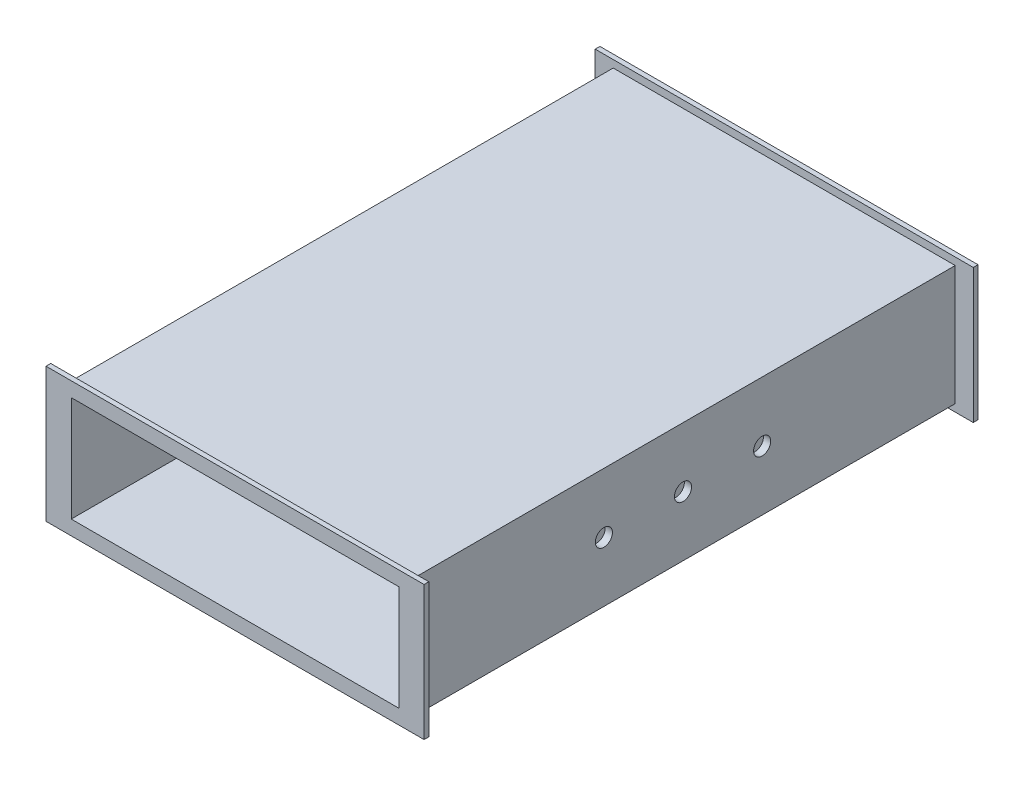
ISO-10303-21;
HEADER;
FILE_DESCRIPTION(('STEP AP214'),'2;1');
FILE_NAME('part.step','',(''),(''),'','','');
FILE_SCHEMA(('AUTOMOTIVE_DESIGN { 1 0 10303 214 1 1 1 1 }'));
ENDSEC;
DATA;
#1=APPLICATION_CONTEXT('core data for automotive mechanical design processes');
#2=APPLICATION_PROTOCOL_DEFINITION('international standard','automotive_design',2000,#1);
#3=PRODUCT_CONTEXT('',#1,'mechanical');
#4=PRODUCT('Part','Part','',(#3));
#5=PRODUCT_RELATED_PRODUCT_CATEGORY('part','',(#4));
#6=PRODUCT_DEFINITION_FORMATION('','',#4);
#7=PRODUCT_DEFINITION_CONTEXT('part definition',#1,'design');
#8=PRODUCT_DEFINITION('design','',#6,#7);
#9=PRODUCT_DEFINITION_SHAPE('','',#8);
#10=(LENGTH_UNIT() NAMED_UNIT(*) SI_UNIT(.MILLI.,.METRE.));
#11=(NAMED_UNIT(*) PLANE_ANGLE_UNIT() SI_UNIT($,.RADIAN.));
#12=(NAMED_UNIT(*) SI_UNIT($,.STERADIAN.) SOLID_ANGLE_UNIT());
#13=UNCERTAINTY_MEASURE_WITH_UNIT(LENGTH_MEASURE(1.E-05),#10,'distance_accuracy_value','');
#14=(GEOMETRIC_REPRESENTATION_CONTEXT(3) GLOBAL_UNCERTAINTY_ASSIGNED_CONTEXT((#13)) GLOBAL_UNIT_ASSIGNED_CONTEXT((#10,
#11,#12)) REPRESENTATION_CONTEXT('',''));
#15=CARTESIAN_POINT('',(0.,0.,0.));
#16=DIRECTION('',(0.,0.,1.));
#17=DIRECTION('',(1.,0.,0.));
#18=AXIS2_PLACEMENT_3D('',#15,#16,#17);
#19=CARTESIAN_POINT('',(0.,0.,247.));
#20=DIRECTION('',(0.,0.,1.));
#21=DIRECTION('',(1.,0.,0.));
#22=AXIS2_PLACEMENT_3D('',#19,#20,#21);
#23=PLANE('',#22);
#24=DIRECTION('',(-1.,0.,0.));
#25=VECTOR('',#24,1.);
#26=CARTESIAN_POINT('',(-19.4454364826301,65.4454364826301,247.));
#27=LINE('',#26,#25);
#28=CARTESIAN_POINT('',(219.44543648263,65.44543648263,247.));
#29=VERTEX_POINT('',#28);
#30=CARTESIAN_POINT('',(-19.4454364826301,65.4454364826301,247.));
#31=VERTEX_POINT('',#30);
#32=EDGE_CURVE('E266',#29,#31,#27,.T.);
#33=ORIENTED_EDGE('',*,*,#32,.F.);
#34=DIRECTION('',(0.,1.,0.));
#35=VECTOR('',#34,1.);
#36=CARTESIAN_POINT('',(219.44543648263,-19.44543648263,247.));
#37=LINE('',#36,#35);
#38=CARTESIAN_POINT('',(219.44543648263,-19.44543648263,247.));
#39=VERTEX_POINT('',#38);
#40=EDGE_CURVE('E276',#39,#29,#37,.T.);
#41=ORIENTED_EDGE('',*,*,#40,.F.);
#42=DIRECTION('',(1.,0.,0.));
#43=VECTOR('',#42,1.);
#44=CARTESIAN_POINT('',(-19.4454364826301,-19.4454364826301,247.));
#45=LINE('',#44,#43);
#46=CARTESIAN_POINT('',(-19.4454364826301,-19.4454364826301,247.));
#47=VERTEX_POINT('',#46);
#48=EDGE_CURVE('E273',#47,#39,#45,.T.);
#49=ORIENTED_EDGE('',*,*,#48,.F.);
#50=DIRECTION('',(0.,-1.,0.));
#51=VECTOR('',#50,1.);
#52=CARTESIAN_POINT('',(-19.4454364826301,65.4454364826301,247.));
#53=LINE('',#52,#51);
#54=EDGE_CURVE('E269',#31,#47,#53,.T.);
#55=ORIENTED_EDGE('',*,*,#54,.F.);
#56=EDGE_LOOP('',(#33,#41,#49,#55));
#57=FACE_BOUND('',#56,.T.);
#58=DIRECTION('',(-1.,0.,0.));
#59=VECTOR('',#58,1.);
#60=CARTESIAN_POINT('',(208.051208249702,60.794841987756,247.));
#61=LINE('',#60,#59);
#62=CARTESIAN_POINT('',(208.051208249702,60.794841987756,247.));
#63=VERTEX_POINT('',#62);
#64=CARTESIAN_POINT('',(-8.05120824970154,60.794841987756,247.));
#65=VERTEX_POINT('',#64);
#66=EDGE_CURVE('E218',#63,#65,#61,.T.);
#67=ORIENTED_EDGE('',*,*,#66,.T.);
#68=DIRECTION('',(0.,-1.,0.));
#69=VECTOR('',#68,1.);
#70=CARTESIAN_POINT('',(-8.05120824970155,60.794841987756,247.));
#71=LINE('',#70,#69);
#72=CARTESIAN_POINT('',(-8.05120824970155,-14.7948419877559,247.));
#73=VERTEX_POINT('',#72);
#74=EDGE_CURVE('E227',#65,#73,#71,.T.);
#75=ORIENTED_EDGE('',*,*,#74,.T.);
#76=DIRECTION('',(1.,0.,0.));
#77=VECTOR('',#76,1.);
#78=CARTESIAN_POINT('',(-8.05120824970155,-14.7948419877559,247.));
#79=LINE('',#78,#77);
#80=CARTESIAN_POINT('',(208.051208249702,-14.7948419877558,247.));
#81=VERTEX_POINT('',#80);
#82=EDGE_CURVE('E70',#73,#81,#79,.T.);
#83=ORIENTED_EDGE('',*,*,#82,.T.);
#84=DIRECTION('',(0.,1.,0.));
#85=VECTOR('',#84,1.);
#86=CARTESIAN_POINT('',(208.051208249702,-14.7948419877558,247.));
#87=LINE('',#86,#85);
#88=EDGE_CURVE('E65',#81,#63,#87,.T.);
#89=ORIENTED_EDGE('',*,*,#88,.T.);
#90=EDGE_LOOP('',(#67,#75,#83,#89));
#91=FACE_BOUND('',#90,.T.);
#92=ADVANCED_FACE('F48',(#57,#91),#23,.F.);
#93=CARTESIAN_POINT('',(-19.4454364826301,65.4454364826301,247.));
#94=DIRECTION('',(0.,1.,0.));
#95=DIRECTION('',(-1.,0.,0.));
#96=AXIS2_PLACEMENT_3D('',#93,#94,#95);
#97=PLANE('',#96);
#98=DIRECTION('',(-1.,0.,0.));
#99=VECTOR('',#98,1.);
#100=CARTESIAN_POINT('',(-19.4454364826301,65.4454364826301,250.));
#101=LINE('',#100,#99);
#102=CARTESIAN_POINT('',(219.44543648263,65.44543648263,250.));
#103=VERTEX_POINT('',#102);
#104=CARTESIAN_POINT('',(-19.4454364826301,65.4454364826301,250.));
#105=VERTEX_POINT('',#104);
#106=EDGE_CURVE('E170',#103,#105,#101,.T.);
#107=ORIENTED_EDGE('',*,*,#106,.F.);
#108=DIRECTION('',(0.,0.,1.));
#109=VECTOR('',#108,1.);
#110=CARTESIAN_POINT('',(219.44543648263,65.44543648263,247.));
#111=LINE('',#110,#109);
#112=EDGE_CURVE('E12',#29,#103,#111,.T.);
#113=ORIENTED_EDGE('',*,*,#112,.F.);
#114=ORIENTED_EDGE('',*,*,#32,.T.);
#115=DIRECTION('',(0.,0.,1.));
#116=VECTOR('',#115,1.);
#117=CARTESIAN_POINT('',(-19.4454364826301,65.4454364826301,247.));
#118=LINE('',#117,#116);
#119=EDGE_CURVE('E279',#31,#105,#118,.T.);
#120=ORIENTED_EDGE('',*,*,#119,.T.);
#121=EDGE_LOOP('',(#107,#113,#114,#120));
#122=FACE_BOUND('',#121,.T.);
#123=ADVANCED_FACE('F50',(#122),#97,.T.);
#124=CARTESIAN_POINT('',(219.44543648263,-19.44543648263,247.));
#125=DIRECTION('',(1.,0.,0.));
#126=DIRECTION('',(0.,1.,0.));
#127=AXIS2_PLACEMENT_3D('',#124,#125,#126);
#128=PLANE('',#127);
#129=DIRECTION('',(0.,1.,0.));
#130=VECTOR('',#129,1.);
#131=CARTESIAN_POINT('',(219.44543648263,-19.44543648263,250.));
#132=LINE('',#131,#130);
#133=CARTESIAN_POINT('',(219.44543648263,-19.44543648263,250.));
#134=VERTEX_POINT('',#133);
#135=EDGE_CURVE('E270',#134,#103,#132,.T.);
#136=ORIENTED_EDGE('',*,*,#135,.F.);
#137=DIRECTION('',(0.,0.,1.));
#138=VECTOR('',#137,1.);
#139=CARTESIAN_POINT('',(219.44543648263,-19.44543648263,247.));
#140=LINE('',#139,#138);
#141=EDGE_CURVE('E57',#39,#134,#140,.T.);
#142=ORIENTED_EDGE('',*,*,#141,.F.);
#143=ORIENTED_EDGE('',*,*,#40,.T.);
#144=ORIENTED_EDGE('',*,*,#112,.T.);
#145=EDGE_LOOP('',(#136,#142,#143,#144));
#146=FACE_BOUND('',#145,.T.);
#147=ADVANCED_FACE('F352',(#146),#128,.T.);
#148=CARTESIAN_POINT('',(-19.4454364826301,-19.4454364826301,247.));
#149=DIRECTION('',(0.,-1.,0.));
#150=DIRECTION('',(1.,0.,0.));
#151=AXIS2_PLACEMENT_3D('',#148,#149,#150);
#152=PLANE('',#151);
#153=DIRECTION('',(1.,0.,0.));
#154=VECTOR('',#153,1.);
#155=CARTESIAN_POINT('',(-19.4454364826301,-19.4454364826301,250.));
#156=LINE('',#155,#154);
#157=CARTESIAN_POINT('',(-19.4454364826301,-19.4454364826301,250.));
#158=VERTEX_POINT('',#157);
#159=EDGE_CURVE('E285',#158,#134,#156,.T.);
#160=ORIENTED_EDGE('',*,*,#159,.F.);
#161=DIRECTION('',(0.,0.,1.));
#162=VECTOR('',#161,1.);
#163=CARTESIAN_POINT('',(-19.4454364826301,-19.4454364826301,247.));
#164=LINE('',#163,#162);
#165=EDGE_CURVE('E291',#47,#158,#164,.T.);
#166=ORIENTED_EDGE('',*,*,#165,.F.);
#167=ORIENTED_EDGE('',*,*,#48,.T.);
#168=ORIENTED_EDGE('',*,*,#141,.T.);
#169=EDGE_LOOP('',(#160,#166,#167,#168));
#170=FACE_BOUND('',#169,.T.);
#171=ADVANCED_FACE('F350',(#170),#152,.T.);
#172=CARTESIAN_POINT('',(-19.4454364826301,65.4454364826301,247.));
#173=DIRECTION('',(-1.,0.,0.));
#174=DIRECTION('',(0.,0.,1.));
#175=AXIS2_PLACEMENT_3D('',#172,#173,#174);
#176=PLANE('',#175);
#177=DIRECTION('',(0.,-1.,0.));
#178=VECTOR('',#177,1.);
#179=CARTESIAN_POINT('',(-19.4454364826301,65.4454364826301,250.));
#180=LINE('',#179,#178);
#181=EDGE_CURVE('E282',#105,#158,#180,.T.);
#182=ORIENTED_EDGE('',*,*,#181,.F.);
#183=ORIENTED_EDGE('',*,*,#119,.F.);
#184=ORIENTED_EDGE('',*,*,#54,.T.);
#185=ORIENTED_EDGE('',*,*,#165,.T.);
#186=EDGE_LOOP('',(#182,#183,#184,#185));
#187=FACE_BOUND('',#186,.T.);
#188=ADVANCED_FACE('F338',(#187),#176,.T.);
#189=CARTESIAN_POINT('',(0.,0.,250.));
#190=DIRECTION('',(0.,0.,1.));
#191=DIRECTION('',(1.,0.,0.));
#192=AXIS2_PLACEMENT_3D('',#189,#190,#191);
#193=PLANE('',#192);
#194=DIRECTION('',(0.,-1.,0.));
#195=VECTOR('',#194,1.);
#196=CARTESIAN_POINT('',(-3.48982774457575,56.233463869769,250.));
#197=LINE('',#196,#195);
#198=CARTESIAN_POINT('',(-3.48982774457575,56.233463869769,250.));
#199=VERTEX_POINT('',#198);
#200=CARTESIAN_POINT('',(-3.48982774457575,-10.23346148263,250.));
#201=VERTEX_POINT('',#200);
#202=EDGE_CURVE('E253',#199,#201,#197,.T.);
#203=ORIENTED_EDGE('',*,*,#202,.F.);
#204=DIRECTION('',(-1.,0.,0.));
#205=VECTOR('',#204,1.);
#206=CARTESIAN_POINT('',(-3.48982774457575,56.233463869769,250.));
#207=LINE('',#206,#205);
#208=CARTESIAN_POINT('',(203.48983084556,56.2334638697689,250.));
#209=VERTEX_POINT('',#208);
#210=EDGE_CURVE('E167',#209,#199,#207,.T.);
#211=ORIENTED_EDGE('',*,*,#210,.F.);
#212=DIRECTION('',(0.,1.,0.));
#213=VECTOR('',#212,1.);
#214=CARTESIAN_POINT('',(203.48983084556,56.2334638697689,250.));
#215=LINE('',#214,#213);
#216=CARTESIAN_POINT('',(203.48983084556,-10.23346148263,250.));
#217=VERTEX_POINT('',#216);
#218=EDGE_CURVE('E258',#217,#209,#215,.T.);
#219=ORIENTED_EDGE('',*,*,#218,.F.);
#220=DIRECTION('',(1.,0.,0.));
#221=VECTOR('',#220,1.);
#222=CARTESIAN_POINT('',(203.48983084556,-10.23346148263,250.));
#223=LINE('',#222,#221);
#224=EDGE_CURVE('E255',#201,#217,#223,.T.);
#225=ORIENTED_EDGE('',*,*,#224,.F.);
#226=EDGE_LOOP('',(#203,#211,#219,#225));
#227=FACE_BOUND('',#226,.T.);
#228=ORIENTED_EDGE('',*,*,#106,.T.);
#229=ORIENTED_EDGE('',*,*,#181,.T.);
#230=ORIENTED_EDGE('',*,*,#159,.T.);
#231=ORIENTED_EDGE('',*,*,#135,.T.);
#232=EDGE_LOOP('',(#228,#229,#230,#231));
#233=FACE_BOUND('',#232,.T.);
#234=ADVANCED_FACE('F335',(#227,#233),#193,.T.);
#235=CARTESIAN_POINT('',(-3.48982774457575,56.233463869769,247.));
#236=DIRECTION('',(-1.,0.,0.));
#237=DIRECTION('',(0.,-1.,0.));
#238=AXIS2_PLACEMENT_3D('',#235,#236,#237);
#239=PLANE('',#238);
#240=CARTESIAN_POINT('',(-3.48982774457576,23.,75.));
#241=DIRECTION('',(-1.,0.,0.));
#242=DIRECTION('',(0.,-1.,0.));
#243=AXIS2_PLACEMENT_3D('',#240,#241,#242);
#244=CIRCLE('',#243,5.4);
#245=CARTESIAN_POINT('',(-3.48982774457576,17.6,75.));
#246=VERTEX_POINT('',#245);
#247=EDGE_CURVE('E326',#246,#246,#244,.T.);
#248=ORIENTED_EDGE('',*,*,#247,.T.);
#249=EDGE_LOOP('',(#248));
#250=FACE_BOUND('',#249,.T.);
#251=CARTESIAN_POINT('',(-3.48982774457576,23.,125.));
#252=DIRECTION('',(-1.,0.,0.));
#253=DIRECTION('',(0.,-1.,0.));
#254=AXIS2_PLACEMENT_3D('',#251,#252,#253);
#255=CIRCLE('',#254,5.40000000000002);
#256=CARTESIAN_POINT('',(-3.48982774457576,17.6,125.));
#257=VERTEX_POINT('',#256);
#258=EDGE_CURVE('E317',#257,#257,#255,.T.);
#259=ORIENTED_EDGE('',*,*,#258,.T.);
#260=EDGE_LOOP('',(#259));
#261=FACE_BOUND('',#260,.T.);
#262=CARTESIAN_POINT('',(-3.48982774457576,22.9999999999997,25.));
#263=DIRECTION('',(-1.,0.,0.));
#264=DIRECTION('',(0.,-1.,0.));
#265=AXIS2_PLACEMENT_3D('',#262,#263,#264);
#266=CIRCLE('',#265,5.4);
#267=CARTESIAN_POINT('',(-3.48982774457576,17.5999999999997,25.));
#268=VERTEX_POINT('',#267);
#269=EDGE_CURVE('E300',#268,#268,#266,.T.);
#270=ORIENTED_EDGE('',*,*,#269,.T.);
#271=EDGE_LOOP('',(#270));
#272=FACE_BOUND('',#271,.T.);
#273=ORIENTED_EDGE('',*,*,#202,.T.);
#274=DIRECTION('',(0.,0.,1.));
#275=VECTOR('',#274,1.);
#276=CARTESIAN_POINT('',(-3.48982774457575,-10.23346148263,247.));
#277=LINE('',#276,#275);
#278=CARTESIAN_POINT('',(-3.48982774457569,-10.23346148263,-100.));
#279=VERTEX_POINT('',#278);
#280=EDGE_CURVE('E177',#279,#201,#277,.T.);
#281=ORIENTED_EDGE('',*,*,#280,.F.);
#282=DIRECTION('',(0.,1.,0.));
#283=VECTOR('',#282,1.);
#284=CARTESIAN_POINT('',(-3.48982774457569,56.2334614826301,-100.));
#285=LINE('',#284,#283);
#286=CARTESIAN_POINT('',(-3.48982774457569,56.2334614826301,-100.));
#287=VERTEX_POINT('',#286);
#288=EDGE_CURVE('E174',#279,#287,#285,.T.);
#289=ORIENTED_EDGE('',*,*,#288,.T.);
#290=DIRECTION('',(0.,0.,1.));
#291=VECTOR('',#290,1.);
#292=CARTESIAN_POINT('',(-3.48982774457575,56.233463869769,247.));
#293=LINE('',#292,#291);
#294=EDGE_CURVE('E160',#287,#199,#293,.T.);
#295=ORIENTED_EDGE('',*,*,#294,.T.);
#296=EDGE_LOOP('',(#273,#281,#289,#295));
#297=FACE_BOUND('',#296,.T.);
#298=ADVANCED_FACE('F175',(#250,#261,#272,#297),#239,.F.);
#299=CARTESIAN_POINT('',(-3.48982774457575,56.233463869769,247.));
#300=DIRECTION('',(0.,1.,0.));
#301=DIRECTION('',(-1.,0.,0.));
#302=AXIS2_PLACEMENT_3D('',#299,#300,#301);
#303=PLANE('',#302);
#304=ORIENTED_EDGE('',*,*,#210,.T.);
#305=ORIENTED_EDGE('',*,*,#294,.F.);
#306=DIRECTION('',(1.,0.,0.));
#307=VECTOR('',#306,1.);
#308=CARTESIAN_POINT('',(203.489827744576,56.23346148263,-100.));
#309=LINE('',#308,#307);
#310=CARTESIAN_POINT('',(203.489827744576,56.23346148263,-100.));
#311=VERTEX_POINT('',#310);
#312=EDGE_CURVE('E164',#287,#311,#309,.T.);
#313=ORIENTED_EDGE('',*,*,#312,.T.);
#314=DIRECTION('',(0.,0.,1.));
#315=VECTOR('',#314,1.);
#316=CARTESIAN_POINT('',(203.48983084556,56.2334638697689,247.));
#317=LINE('',#316,#315);
#318=EDGE_CURVE('E171',#311,#209,#317,.T.);
#319=ORIENTED_EDGE('',*,*,#318,.T.);
#320=EDGE_LOOP('',(#304,#305,#313,#319));
#321=FACE_BOUND('',#320,.T.);
#322=ADVANCED_FACE('F162',(#321),#303,.F.);
#323=CARTESIAN_POINT('',(203.48983084556,56.2334638697689,247.));
#324=DIRECTION('',(1.,0.,0.));
#325=DIRECTION('',(0.,1.,0.));
#326=AXIS2_PLACEMENT_3D('',#323,#324,#325);
#327=PLANE('',#326);
#328=CARTESIAN_POINT('',(203.48983084556,23.,75.));
#329=DIRECTION('',(1.,0.,0.));
#330=DIRECTION('',(0.,1.,0.));
#331=AXIS2_PLACEMENT_3D('',#328,#329,#330);
#332=CIRCLE('',#331,5.4);
#333=CARTESIAN_POINT('',(203.48983084556,28.4,75.));
#334=VERTEX_POINT('',#333);
#335=EDGE_CURVE('E323',#334,#334,#332,.T.);
#336=ORIENTED_EDGE('',*,*,#335,.T.);
#337=EDGE_LOOP('',(#336));
#338=FACE_BOUND('',#337,.T.);
#339=CARTESIAN_POINT('',(203.48983084556,23.,125.));
#340=DIRECTION('',(1.,0.,0.));
#341=DIRECTION('',(0.,1.,0.));
#342=AXIS2_PLACEMENT_3D('',#339,#340,#341);
#343=CIRCLE('',#342,5.40000000000002);
#344=CARTESIAN_POINT('',(203.48983084556,28.4,125.));
#345=VERTEX_POINT('',#344);
#346=EDGE_CURVE('E304',#345,#345,#343,.T.);
#347=ORIENTED_EDGE('',*,*,#346,.T.);
#348=EDGE_LOOP('',(#347));
#349=FACE_BOUND('',#348,.T.);
#350=CARTESIAN_POINT('',(203.48983084556,22.9999999999997,25.));
#351=DIRECTION('',(1.,0.,0.));
#352=DIRECTION('',(0.,1.,0.));
#353=AXIS2_PLACEMENT_3D('',#350,#351,#352);
#354=CIRCLE('',#353,5.4);
#355=CARTESIAN_POINT('',(203.48983084556,28.3999999999997,25.));
#356=VERTEX_POINT('',#355);
#357=EDGE_CURVE('E307',#356,#356,#354,.T.);
#358=ORIENTED_EDGE('',*,*,#357,.T.);
#359=EDGE_LOOP('',(#358));
#360=FACE_BOUND('',#359,.T.);
#361=ORIENTED_EDGE('',*,*,#218,.T.);
#362=ORIENTED_EDGE('',*,*,#318,.F.);
#363=DIRECTION('',(0.,-1.,0.));
#364=VECTOR('',#363,1.);
#365=CARTESIAN_POINT('',(203.489827744576,-10.23346148263,-100.));
#366=LINE('',#365,#364);
#367=CARTESIAN_POINT('',(203.489827744576,-10.23346148263,-100.));
#368=VERTEX_POINT('',#367);
#369=EDGE_CURVE('E186',#311,#368,#366,.T.);
#370=ORIENTED_EDGE('',*,*,#369,.T.);
#371=DIRECTION('',(0.,0.,1.));
#372=VECTOR('',#371,1.);
#373=CARTESIAN_POINT('',(203.48983084556,-10.23346148263,247.));
#374=LINE('',#373,#372);
#375=EDGE_CURVE('E263',#368,#217,#374,.T.);
#376=ORIENTED_EDGE('',*,*,#375,.T.);
#377=EDGE_LOOP('',(#361,#362,#370,#376));
#378=FACE_BOUND('',#377,.T.);
#379=ADVANCED_FACE('F333',(#338,#349,#360,#378),#327,.F.);
#380=CARTESIAN_POINT('',(203.48983084556,-10.23346148263,247.));
#381=DIRECTION('',(0.,-1.,0.));
#382=DIRECTION('',(1.,0.,0.));
#383=AXIS2_PLACEMENT_3D('',#380,#381,#382);
#384=PLANE('',#383);
#385=ORIENTED_EDGE('',*,*,#224,.T.);
#386=ORIENTED_EDGE('',*,*,#375,.F.);
#387=DIRECTION('',(-1.,0.,0.));
#388=VECTOR('',#387,1.);
#389=CARTESIAN_POINT('',(203.489827744576,-10.23346148263,-100.));
#390=LINE('',#389,#388);
#391=EDGE_CURVE('E181',#368,#279,#390,.T.);
#392=ORIENTED_EDGE('',*,*,#391,.T.);
#393=ORIENTED_EDGE('',*,*,#280,.T.);
#394=EDGE_LOOP('',(#385,#386,#392,#393));
#395=FACE_BOUND('',#394,.T.);
#396=ADVANCED_FACE('F329',(#395),#384,.F.);
#397=CARTESIAN_POINT('',(208.051208249702,60.794841987756,475.941159996186));
#398=DIRECTION('',(0.,-1.,0.));
#399=DIRECTION('',(0.,0.,-1.));
#400=AXIS2_PLACEMENT_3D('',#397,#398,#399);
#401=PLANE('',#400);
#402=ORIENTED_EDGE('',*,*,#66,.F.);
#403=DIRECTION('',(0.,0.,-1.));
#404=VECTOR('',#403,1.);
#405=CARTESIAN_POINT('',(208.051208249702,60.794841987756,475.941159996186));
#406=LINE('',#405,#404);
#407=CARTESIAN_POINT('',(208.051208249702,60.794841987756,-97.));
#408=VERTEX_POINT('',#407);
#409=EDGE_CURVE('E244',#63,#408,#406,.T.);
#410=ORIENTED_EDGE('',*,*,#409,.T.);
#411=DIRECTION('',(-1.,0.,0.));
#412=VECTOR('',#411,1.);
#413=CARTESIAN_POINT('',(208.051208249702,60.794841987756,-97.));
#414=LINE('',#413,#412);
#415=CARTESIAN_POINT('',(-8.05120824970155,60.794841987756,-97.));
#416=VERTEX_POINT('',#415);
#417=EDGE_CURVE('E238',#408,#416,#414,.T.);
#418=ORIENTED_EDGE('',*,*,#417,.T.);
#419=DIRECTION('',(0.,0.,-1.));
#420=VECTOR('',#419,1.);
#421=CARTESIAN_POINT('',(-8.05120824970155,60.794841987756,475.941159996186));
#422=LINE('',#421,#420);
#423=EDGE_CURVE('E241',#65,#416,#422,.T.);
#424=ORIENTED_EDGE('',*,*,#423,.F.);
#425=EDGE_LOOP('',(#402,#410,#418,#424));
#426=FACE_BOUND('',#425,.T.);
#427=ADVANCED_FACE('F361',(#426),#401,.F.);
#428=CARTESIAN_POINT('',(208.051208249702,-14.7948419877558,475.941159996186));
#429=DIRECTION('',(-1.,0.,0.));
#430=DIRECTION('',(0.,0.,1.));
#431=AXIS2_PLACEMENT_3D('',#428,#429,#430);
#432=PLANE('',#431);
#433=CARTESIAN_POINT('',(208.051208249702,23.,75.));
#434=DIRECTION('',(-1.,0.,0.));
#435=DIRECTION('',(0.,0.,1.));
#436=AXIS2_PLACEMENT_3D('',#433,#434,#435);
#437=CIRCLE('',#436,5.4);
#438=CARTESIAN_POINT('',(208.051208249702,23.,80.4));
#439=VERTEX_POINT('',#438);
#440=EDGE_CURVE('E320',#439,#439,#437,.T.);
#441=ORIENTED_EDGE('',*,*,#440,.T.);
#442=EDGE_LOOP('',(#441));
#443=FACE_BOUND('',#442,.T.);
#444=CARTESIAN_POINT('',(208.051208249702,23.,125.));
#445=DIRECTION('',(-1.,0.,0.));
#446=DIRECTION('',(0.,0.,1.));
#447=AXIS2_PLACEMENT_3D('',#444,#445,#446);
#448=CIRCLE('',#447,5.40000000000002);
#449=CARTESIAN_POINT('',(208.051208249702,23.,130.4));
#450=VERTEX_POINT('',#449);
#451=EDGE_CURVE('E299',#450,#450,#448,.T.);
#452=ORIENTED_EDGE('',*,*,#451,.T.);
#453=EDGE_LOOP('',(#452));
#454=FACE_BOUND('',#453,.T.);
#455=CARTESIAN_POINT('',(208.051208249702,22.9999999999997,25.));
#456=DIRECTION('',(-1.,0.,0.));
#457=DIRECTION('',(0.,0.,1.));
#458=AXIS2_PLACEMENT_3D('',#455,#456,#457);
#459=CIRCLE('',#458,5.4);
#460=CARTESIAN_POINT('',(208.051208249702,22.9999999999997,30.4));
#461=VERTEX_POINT('',#460);
#462=EDGE_CURVE('E296',#461,#461,#459,.T.);
#463=ORIENTED_EDGE('',*,*,#462,.T.);
#464=EDGE_LOOP('',(#463));
#465=FACE_BOUND('',#464,.T.);
#466=ORIENTED_EDGE('',*,*,#88,.F.);
#467=DIRECTION('',(0.,0.,-1.));
#468=VECTOR('',#467,1.);
#469=CARTESIAN_POINT('',(208.051208249702,-14.7948419877558,475.941159996186));
#470=LINE('',#469,#468);
#471=CARTESIAN_POINT('',(208.051208249702,-14.7948419877558,-97.));
#472=VERTEX_POINT('',#471);
#473=EDGE_CURVE('E247',#81,#472,#470,.T.);
#474=ORIENTED_EDGE('',*,*,#473,.T.);
#475=DIRECTION('',(0.,1.,0.));
#476=VECTOR('',#475,1.);
#477=CARTESIAN_POINT('',(208.051208249702,-14.7948419877558,-97.));
#478=LINE('',#477,#476);
#479=EDGE_CURVE('E235',#472,#408,#478,.T.);
#480=ORIENTED_EDGE('',*,*,#479,.T.);
#481=ORIENTED_EDGE('',*,*,#409,.F.);
#482=EDGE_LOOP('',(#466,#474,#480,#481));
#483=FACE_BOUND('',#482,.T.);
#484=ADVANCED_FACE('F369',(#443,#454,#465,#483),#432,.F.);
#485=CARTESIAN_POINT('',(-8.05120824970155,-14.7948419877559,475.941159996186));
#486=DIRECTION('',(0.,1.,0.));
#487=DIRECTION('',(-1.,0.,0.));
#488=AXIS2_PLACEMENT_3D('',#485,#486,#487);
#489=PLANE('',#488);
#490=ORIENTED_EDGE('',*,*,#82,.F.);
#491=DIRECTION('',(0.,0.,-1.));
#492=VECTOR('',#491,1.);
#493=CARTESIAN_POINT('',(-8.05120824970155,-14.7948419877559,475.941159996186));
#494=LINE('',#493,#492);
#495=CARTESIAN_POINT('',(-8.05120824970155,-14.7948419877559,-97.));
#496=VERTEX_POINT('',#495);
#497=EDGE_CURVE('E250',#73,#496,#494,.T.);
#498=ORIENTED_EDGE('',*,*,#497,.T.);
#499=DIRECTION('',(1.,0.,0.));
#500=VECTOR('',#499,1.);
#501=CARTESIAN_POINT('',(-8.05120824970155,-14.7948419877559,-97.));
#502=LINE('',#501,#500);
#503=EDGE_CURVE('E232',#496,#472,#502,.T.);
#504=ORIENTED_EDGE('',*,*,#503,.T.);
#505=ORIENTED_EDGE('',*,*,#473,.F.);
#506=EDGE_LOOP('',(#490,#498,#504,#505));
#507=FACE_BOUND('',#506,.T.);
#508=ADVANCED_FACE('F366',(#507),#489,.F.);
#509=CARTESIAN_POINT('',(-8.05120824970155,60.794841987756,475.941159996186));
#510=DIRECTION('',(1.,0.,0.));
#511=DIRECTION('',(0.,0.,-1.));
#512=AXIS2_PLACEMENT_3D('',#509,#510,#511);
#513=PLANE('',#512);
#514=CARTESIAN_POINT('',(-8.05120824970154,23.,75.));
#515=DIRECTION('',(1.,0.,0.));
#516=DIRECTION('',(0.,0.,-1.));
#517=AXIS2_PLACEMENT_3D('',#514,#515,#516);
#518=CIRCLE('',#517,5.4);
#519=CARTESIAN_POINT('',(-8.05120824970154,23.,69.6));
#520=VERTEX_POINT('',#519);
#521=EDGE_CURVE('E52',#520,#520,#518,.T.);
#522=ORIENTED_EDGE('',*,*,#521,.T.);
#523=EDGE_LOOP('',(#522));
#524=FACE_BOUND('',#523,.T.);
#525=CARTESIAN_POINT('',(-8.05120824970154,23.,125.));
#526=DIRECTION('',(1.,0.,0.));
#527=DIRECTION('',(0.,0.,-1.));
#528=AXIS2_PLACEMENT_3D('',#525,#526,#527);
#529=CIRCLE('',#528,5.40000000000002);
#530=CARTESIAN_POINT('',(-8.05120824970154,23.,119.6));
#531=VERTEX_POINT('',#530);
#532=EDGE_CURVE('E297',#531,#531,#529,.T.);
#533=ORIENTED_EDGE('',*,*,#532,.T.);
#534=EDGE_LOOP('',(#533));
#535=FACE_BOUND('',#534,.T.);
#536=CARTESIAN_POINT('',(-8.05120824970154,22.9999999999997,25.));
#537=DIRECTION('',(1.,0.,0.));
#538=DIRECTION('',(0.,0.,-1.));
#539=AXIS2_PLACEMENT_3D('',#536,#537,#538);
#540=CIRCLE('',#539,5.4);
#541=CARTESIAN_POINT('',(-8.05120824970154,22.9999999999997,19.6));
#542=VERTEX_POINT('',#541);
#543=EDGE_CURVE('E294',#542,#542,#540,.T.);
#544=ORIENTED_EDGE('',*,*,#543,.T.);
#545=EDGE_LOOP('',(#544));
#546=FACE_BOUND('',#545,.T.);
#547=ORIENTED_EDGE('',*,*,#74,.F.);
#548=ORIENTED_EDGE('',*,*,#423,.T.);
#549=DIRECTION('',(0.,-1.,0.));
#550=VECTOR('',#549,1.);
#551=CARTESIAN_POINT('',(-8.05120824970155,60.794841987756,-97.));
#552=LINE('',#551,#550);
#553=EDGE_CURVE('E229',#416,#496,#552,.T.);
#554=ORIENTED_EDGE('',*,*,#553,.T.);
#555=ORIENTED_EDGE('',*,*,#497,.F.);
#556=EDGE_LOOP('',(#547,#548,#554,#555));
#557=FACE_BOUND('',#556,.T.);
#558=ADVANCED_FACE('F364',(#524,#535,#546,#557),#513,.F.);
#559=CARTESIAN_POINT('',(219.44543648263,65.44543648263,-97.));
#560=DIRECTION('',(1.,0.,0.));
#561=DIRECTION('',(0.,0.,-1.));
#562=AXIS2_PLACEMENT_3D('',#559,#560,#561);
#563=PLANE('',#562);
#564=DIRECTION('',(0.,-1.,0.));
#565=VECTOR('',#564,1.);
#566=CARTESIAN_POINT('',(219.44543648263,65.44543648263,-100.));
#567=LINE('',#566,#565);
#568=CARTESIAN_POINT('',(219.44543648263,65.44543648263,-100.));
#569=VERTEX_POINT('',#568);
#570=CARTESIAN_POINT('',(219.44543648263,-19.4454364826301,-100.));
#571=VERTEX_POINT('',#570);
#572=EDGE_CURVE('E188',#569,#571,#567,.T.);
#573=ORIENTED_EDGE('',*,*,#572,.F.);
#574=DIRECTION('',(0.,0.,-1.));
#575=VECTOR('',#574,1.);
#576=CARTESIAN_POINT('',(219.44543648263,65.44543648263,-97.));
#577=LINE('',#576,#575);
#578=CARTESIAN_POINT('',(219.44543648263,65.44543648263,-97.));
#579=VERTEX_POINT('',#578);
#580=EDGE_CURVE('E216',#579,#569,#577,.T.);
#581=ORIENTED_EDGE('',*,*,#580,.F.);
#582=DIRECTION('',(0.,-1.,0.));
#583=VECTOR('',#582,1.);
#584=CARTESIAN_POINT('',(219.44543648263,65.44543648263,-97.));
#585=LINE('',#584,#583);
#586=CARTESIAN_POINT('',(219.44543648263,-19.4454364826301,-97.));
#587=VERTEX_POINT('',#586);
#588=EDGE_CURVE('E192',#579,#587,#585,.T.);
#589=ORIENTED_EDGE('',*,*,#588,.T.);
#590=DIRECTION('',(0.,0.,-1.));
#591=VECTOR('',#590,1.);
#592=CARTESIAN_POINT('',(219.44543648263,-19.4454364826301,-97.));
#593=LINE('',#592,#591);
#594=EDGE_CURVE('E205',#587,#571,#593,.T.);
#595=ORIENTED_EDGE('',*,*,#594,.T.);
#596=EDGE_LOOP('',(#573,#581,#589,#595));
#597=FACE_BOUND('',#596,.T.);
#598=ADVANCED_FACE('F390',(#597),#563,.T.);
#599=CARTESIAN_POINT('',(219.44543648263,65.44543648263,-97.));
#600=DIRECTION('',(0.,1.,0.));
#601=DIRECTION('',(0.,0.,1.));
#602=AXIS2_PLACEMENT_3D('',#599,#600,#601);
#603=PLANE('',#602);
#604=DIRECTION('',(1.,0.,0.));
#605=VECTOR('',#604,1.);
#606=CARTESIAN_POINT('',(219.44543648263,65.44543648263,-100.));
#607=LINE('',#606,#605);
#608=CARTESIAN_POINT('',(-19.4454364826301,65.44543648263,-100.));
#609=VERTEX_POINT('',#608);
#610=EDGE_CURVE('E196',#609,#569,#607,.T.);
#611=ORIENTED_EDGE('',*,*,#610,.F.);
#612=DIRECTION('',(0.,0.,-1.));
#613=VECTOR('',#612,1.);
#614=CARTESIAN_POINT('',(-19.4454364826301,65.44543648263,-97.));
#615=LINE('',#614,#613);
#616=CARTESIAN_POINT('',(-19.4454364826301,65.44543648263,-97.));
#617=VERTEX_POINT('',#616);
#618=EDGE_CURVE('E219',#617,#609,#615,.T.);
#619=ORIENTED_EDGE('',*,*,#618,.F.);
#620=DIRECTION('',(1.,0.,0.));
#621=VECTOR('',#620,1.);
#622=CARTESIAN_POINT('',(219.44543648263,65.44543648263,-97.));
#623=LINE('',#622,#621);
#624=EDGE_CURVE('E202',#617,#579,#623,.T.);
#625=ORIENTED_EDGE('',*,*,#624,.T.);
#626=ORIENTED_EDGE('',*,*,#580,.T.);
#627=EDGE_LOOP('',(#611,#619,#625,#626));
#628=FACE_BOUND('',#627,.T.);
#629=ADVANCED_FACE('F383',(#628),#603,.T.);
#630=CARTESIAN_POINT('',(-19.4454364826301,65.44543648263,-97.));
#631=DIRECTION('',(-1.,0.,0.));
#632=DIRECTION('',(0.,0.,1.));
#633=AXIS2_PLACEMENT_3D('',#630,#631,#632);
#634=PLANE('',#633);
#635=DIRECTION('',(0.,1.,0.));
#636=VECTOR('',#635,1.);
#637=CARTESIAN_POINT('',(-19.4454364826301,65.44543648263,-100.));
#638=LINE('',#637,#636);
#639=CARTESIAN_POINT('',(-19.4454364826301,-19.4454364826301,-100.));
#640=VERTEX_POINT('',#639);
#641=EDGE_CURVE('E211',#640,#609,#638,.T.);
#642=ORIENTED_EDGE('',*,*,#641,.F.);
#643=DIRECTION('',(0.,0.,-1.));
#644=VECTOR('',#643,1.);
#645=CARTESIAN_POINT('',(-19.4454364826301,-19.4454364826301,-97.));
#646=LINE('',#645,#644);
#647=CARTESIAN_POINT('',(-19.4454364826301,-19.4454364826301,-97.));
#648=VERTEX_POINT('',#647);
#649=EDGE_CURVE('E221',#648,#640,#646,.T.);
#650=ORIENTED_EDGE('',*,*,#649,.F.);
#651=DIRECTION('',(0.,1.,0.));
#652=VECTOR('',#651,1.);
#653=CARTESIAN_POINT('',(-19.4454364826301,65.44543648263,-97.));
#654=LINE('',#653,#652);
#655=EDGE_CURVE('E199',#648,#617,#654,.T.);
#656=ORIENTED_EDGE('',*,*,#655,.T.);
#657=ORIENTED_EDGE('',*,*,#618,.T.);
#658=EDGE_LOOP('',(#642,#650,#656,#657));
#659=FACE_BOUND('',#658,.T.);
#660=ADVANCED_FACE('F387',(#659),#634,.T.);
#661=CARTESIAN_POINT('',(219.44543648263,-19.4454364826301,-97.));
#662=DIRECTION('',(0.,-1.,0.));
#663=DIRECTION('',(0.,0.,-1.));
#664=AXIS2_PLACEMENT_3D('',#661,#662,#663);
#665=PLANE('',#664);
#666=DIRECTION('',(-1.,0.,0.));
#667=VECTOR('',#666,1.);
#668=CARTESIAN_POINT('',(219.44543648263,-19.4454364826301,-100.));
#669=LINE('',#668,#667);
#670=EDGE_CURVE('E208',#571,#640,#669,.T.);
#671=ORIENTED_EDGE('',*,*,#670,.F.);
#672=ORIENTED_EDGE('',*,*,#594,.F.);
#673=DIRECTION('',(-1.,0.,0.));
#674=VECTOR('',#673,1.);
#675=CARTESIAN_POINT('',(219.44543648263,-19.4454364826301,-97.));
#676=LINE('',#675,#674);
#677=EDGE_CURVE('E195',#587,#648,#676,.T.);
#678=ORIENTED_EDGE('',*,*,#677,.T.);
#679=ORIENTED_EDGE('',*,*,#649,.T.);
#680=EDGE_LOOP('',(#671,#672,#678,#679));
#681=FACE_BOUND('',#680,.T.);
#682=ADVANCED_FACE('F374',(#681),#665,.T.);
#683=CARTESIAN_POINT('',(0.,0.,-97.));
#684=DIRECTION('',(0.,0.,-1.));
#685=DIRECTION('',(-1.,0.,0.));
#686=AXIS2_PLACEMENT_3D('',#683,#684,#685);
#687=PLANE('',#686);
#688=ORIENTED_EDGE('',*,*,#553,.F.);
#689=ORIENTED_EDGE('',*,*,#417,.F.);
#690=ORIENTED_EDGE('',*,*,#479,.F.);
#691=ORIENTED_EDGE('',*,*,#503,.F.);
#692=EDGE_LOOP('',(#688,#689,#690,#691));
#693=FACE_BOUND('',#692,.T.);
#694=ORIENTED_EDGE('',*,*,#588,.F.);
#695=ORIENTED_EDGE('',*,*,#624,.F.);
#696=ORIENTED_EDGE('',*,*,#655,.F.);
#697=ORIENTED_EDGE('',*,*,#677,.F.);
#698=EDGE_LOOP('',(#694,#695,#696,#697));
#699=FACE_BOUND('',#698,.T.);
#700=ADVANCED_FACE('F371',(#693,#699),#687,.F.);
#701=CARTESIAN_POINT('',(0.,0.,-100.));
#702=DIRECTION('',(0.,0.,-1.));
#703=DIRECTION('',(-1.,0.,0.));
#704=AXIS2_PLACEMENT_3D('',#701,#702,#703);
#705=PLANE('',#704);
#706=ORIENTED_EDGE('',*,*,#391,.F.);
#707=ORIENTED_EDGE('',*,*,#369,.F.);
#708=ORIENTED_EDGE('',*,*,#312,.F.);
#709=ORIENTED_EDGE('',*,*,#288,.F.);
#710=EDGE_LOOP('',(#706,#707,#708,#709));
#711=FACE_BOUND('',#710,.T.);
#712=ORIENTED_EDGE('',*,*,#572,.T.);
#713=ORIENTED_EDGE('',*,*,#670,.T.);
#714=ORIENTED_EDGE('',*,*,#641,.T.);
#715=ORIENTED_EDGE('',*,*,#610,.T.);
#716=EDGE_LOOP('',(#712,#713,#714,#715));
#717=FACE_BOUND('',#716,.T.);
#718=ADVANCED_FACE('F183',(#711,#717),#705,.T.);
#719=CARTESIAN_POINT('',(219.44543648263,22.9999999999997,25.));
#720=DIRECTION('',(-1.,0.,0.));
#721=DIRECTION('',(0.,0.,1.));
#722=AXIS2_PLACEMENT_3D('',#719,#720,#721);
#723=CYLINDRICAL_SURFACE('',#722,5.4);
#724=ORIENTED_EDGE('',*,*,#543,.F.);
#725=EDGE_LOOP('',(#724));
#726=FACE_BOUND('',#725,.T.);
#727=ORIENTED_EDGE('',*,*,#269,.F.);
#728=EDGE_LOOP('',(#727));
#729=FACE_BOUND('',#728,.T.);
#730=ADVANCED_FACE('F392',(#726,#729),#723,.F.);
#731=CARTESIAN_POINT('',(219.44543648263,23.,125.));
#732=DIRECTION('',(-1.,0.,0.));
#733=DIRECTION('',(0.,0.,1.));
#734=AXIS2_PLACEMENT_3D('',#731,#732,#733);
#735=CYLINDRICAL_SURFACE('',#734,5.40000000000002);
#736=ORIENTED_EDGE('',*,*,#532,.F.);
#737=EDGE_LOOP('',(#736));
#738=FACE_BOUND('',#737,.T.);
#739=ORIENTED_EDGE('',*,*,#258,.F.);
#740=EDGE_LOOP('',(#739));
#741=FACE_BOUND('',#740,.T.);
#742=ADVANCED_FACE('F397',(#738,#741),#735,.F.);
#743=CARTESIAN_POINT('',(219.44543648263,23.,75.));
#744=DIRECTION('',(-1.,0.,0.));
#745=DIRECTION('',(0.,0.,1.));
#746=AXIS2_PLACEMENT_3D('',#743,#744,#745);
#747=CYLINDRICAL_SURFACE('',#746,5.4);
#748=ORIENTED_EDGE('',*,*,#521,.F.);
#749=EDGE_LOOP('',(#748));
#750=FACE_BOUND('',#749,.T.);
#751=ORIENTED_EDGE('',*,*,#247,.F.);
#752=EDGE_LOOP('',(#751));
#753=FACE_BOUND('',#752,.T.);
#754=ADVANCED_FACE('F588',(#750,#753),#747,.F.);
#755=ORIENTED_EDGE('',*,*,#462,.F.);
#756=EDGE_LOOP('',(#755));
#757=FACE_BOUND('',#756,.T.);
#758=ORIENTED_EDGE('',*,*,#357,.F.);
#759=EDGE_LOOP('',(#758));
#760=FACE_BOUND('',#759,.T.);
#761=ADVANCED_FACE('F400',(#757,#760),#723,.F.);
#762=ORIENTED_EDGE('',*,*,#451,.F.);
#763=EDGE_LOOP('',(#762));
#764=FACE_BOUND('',#763,.T.);
#765=ORIENTED_EDGE('',*,*,#346,.F.);
#766=EDGE_LOOP('',(#765));
#767=FACE_BOUND('',#766,.T.);
#768=ADVANCED_FACE('F591',(#764,#767),#735,.F.);
#769=ORIENTED_EDGE('',*,*,#440,.F.);
#770=EDGE_LOOP('',(#769));
#771=FACE_BOUND('',#770,.T.);
#772=ORIENTED_EDGE('',*,*,#335,.F.);
#773=EDGE_LOOP('',(#772));
#774=FACE_BOUND('',#773,.T.);
#775=ADVANCED_FACE('F600',(#771,#774),#747,.F.);
#776=CLOSED_SHELL('',(#92,#123,#147,#171,#188,#234,#298,#322,#379,#396,#427,#484,#508,#558,#598,
#629,#660,#682,#700,#718,#730,#742,#754,#761,#768,#775));
#777=MANIFOLD_SOLID_BREP('B2',#776);
#778=CARTESIAN_POINT('',(0.,0.,150.));
#779=DIRECTION('',(1.,0.,0.));
#780=DIRECTION('',(0.,0.,-1.));
#781=AXIS2_PLACEMENT_3D('',#778,#779,#780);
#782=PLANE('',#781);
#783=CARTESIAN_POINT('',(0.,23.,75.));
#784=DIRECTION('',(1.,0.,0.));
#785=DIRECTION('',(0.,0.,-1.));
#786=AXIS2_PLACEMENT_3D('',#783,#784,#785);
#787=CIRCLE('',#786,5.4);
#788=CARTESIAN_POINT('',(0.,23.,69.6));
#789=VERTEX_POINT('',#788);
#790=EDGE_CURVE('E723',#789,#789,#787,.T.);
#791=ORIENTED_EDGE('',*,*,#790,.T.);
#792=EDGE_LOOP('',(#791));
#793=FACE_BOUND('',#792,.T.);
#794=CARTESIAN_POINT('',(0.,23.,125.));
#795=DIRECTION('',(1.,0.,0.));
#796=DIRECTION('',(0.,0.,-1.));
#797=AXIS2_PLACEMENT_3D('',#794,#795,#796);
#798=CIRCLE('',#797,5.40000000000002);
#799=CARTESIAN_POINT('',(0.,23.,119.6));
#800=VERTEX_POINT('',#799);
#801=EDGE_CURVE('E734',#800,#800,#798,.T.);
#802=ORIENTED_EDGE('',*,*,#801,.T.);
#803=EDGE_LOOP('',(#802));
#804=FACE_BOUND('',#803,.T.);
#805=CARTESIAN_POINT('',(0.,22.9999999999997,25.));
#806=DIRECTION('',(1.,0.,0.));
#807=DIRECTION('',(0.,0.,-1.));
#808=AXIS2_PLACEMENT_3D('',#805,#806,#807);
#809=CIRCLE('',#808,5.4);
#810=CARTESIAN_POINT('',(0.,22.9999999999997,19.6));
#811=VERTEX_POINT('',#810);
#812=EDGE_CURVE('E731',#811,#811,#809,.T.);
#813=ORIENTED_EDGE('',*,*,#812,.T.);
#814=EDGE_LOOP('',(#813));
#815=FACE_BOUND('',#814,.T.);
#816=DIRECTION('',(0.,-1.,0.));
#817=VECTOR('',#816,1.);
#818=CARTESIAN_POINT('',(0.,0.,0.));
#819=LINE('',#818,#817);
#820=CARTESIAN_POINT('',(0.,46.,0.));
#821=VERTEX_POINT('',#820);
#822=CARTESIAN_POINT('',(0.,0.,0.));
#823=VERTEX_POINT('',#822);
#824=EDGE_CURVE('E720',#821,#823,#819,.T.);
#825=ORIENTED_EDGE('',*,*,#824,.T.);
#826=DIRECTION('',(0.,0.,-1.));
#827=VECTOR('',#826,1.);
#828=CARTESIAN_POINT('',(0.,0.,150.));
#829=LINE('',#828,#827);
#830=CARTESIAN_POINT('',(0.,0.,150.));
#831=VERTEX_POINT('',#830);
#832=EDGE_CURVE('E46',#831,#823,#829,.T.);
#833=ORIENTED_EDGE('',*,*,#832,.F.);
#834=DIRECTION('',(0.,-1.,0.));
#835=VECTOR('',#834,1.);
#836=CARTESIAN_POINT('',(0.,0.,150.));
#837=LINE('',#836,#835);
#838=CARTESIAN_POINT('',(0.,46.,150.));
#839=VERTEX_POINT('',#838);
#840=EDGE_CURVE('E707',#839,#831,#837,.T.);
#841=ORIENTED_EDGE('',*,*,#840,.F.);
#842=DIRECTION('',(0.,0.,-1.));
#843=VECTOR('',#842,1.);
#844=CARTESIAN_POINT('',(0.,46.,150.));
#845=LINE('',#844,#843);
#846=EDGE_CURVE('E716',#839,#821,#845,.T.);
#847=ORIENTED_EDGE('',*,*,#846,.T.);
#848=EDGE_LOOP('',(#825,#833,#841,#847));
#849=FACE_BOUND('',#848,.T.);
#850=ADVANCED_FACE('F654',(#793,#804,#815,#849),#782,.F.);
#851=CARTESIAN_POINT('',(0.,0.,150.));
#852=DIRECTION('',(0.,1.,0.));
#853=DIRECTION('',(0.,0.,1.));
#854=AXIS2_PLACEMENT_3D('',#851,#852,#853);
#855=PLANE('',#854);
#856=DIRECTION('',(1.,0.,0.));
#857=VECTOR('',#856,1.);
#858=CARTESIAN_POINT('',(0.,0.,0.));
#859=LINE('',#858,#857);
#860=CARTESIAN_POINT('',(200.,0.,0.));
#861=VERTEX_POINT('',#860);
#862=EDGE_CURVE('E711',#823,#861,#859,.T.);
#863=ORIENTED_EDGE('',*,*,#862,.T.);
#864=DIRECTION('',(0.,0.,-1.));
#865=VECTOR('',#864,1.);
#866=CARTESIAN_POINT('',(200.,0.,150.));
#867=LINE('',#866,#865);
#868=CARTESIAN_POINT('',(200.,0.,150.));
#869=VERTEX_POINT('',#868);
#870=EDGE_CURVE('E663',#869,#861,#867,.T.);
#871=ORIENTED_EDGE('',*,*,#870,.F.);
#872=DIRECTION('',(1.,0.,0.));
#873=VECTOR('',#872,1.);
#874=CARTESIAN_POINT('',(0.,0.,150.));
#875=LINE('',#874,#873);
#876=EDGE_CURVE('E702',#831,#869,#875,.T.);
#877=ORIENTED_EDGE('',*,*,#876,.F.);
#878=ORIENTED_EDGE('',*,*,#832,.T.);
#879=EDGE_LOOP('',(#863,#871,#877,#878));
#880=FACE_BOUND('',#879,.T.);
#881=ADVANCED_FACE('F710',(#880),#855,.F.);
#882=CARTESIAN_POINT('',(200.,0.,150.));
#883=DIRECTION('',(-1.,0.,0.));
#884=DIRECTION('',(0.,0.,1.));
#885=AXIS2_PLACEMENT_3D('',#882,#883,#884);
#886=PLANE('',#885);
#887=CARTESIAN_POINT('',(200.,23.,75.));
#888=DIRECTION('',(-1.,0.,0.));
#889=DIRECTION('',(0.,0.,1.));
#890=AXIS2_PLACEMENT_3D('',#887,#888,#889);
#891=CIRCLE('',#890,5.4);
#892=CARTESIAN_POINT('',(200.,23.,80.4));
#893=VERTEX_POINT('',#892);
#894=EDGE_CURVE('E657',#893,#893,#891,.T.);
#895=ORIENTED_EDGE('',*,*,#894,.T.);
#896=EDGE_LOOP('',(#895));
#897=FACE_BOUND('',#896,.T.);
#898=CARTESIAN_POINT('',(200.,23.,125.));
#899=DIRECTION('',(-1.,0.,0.));
#900=DIRECTION('',(0.,0.,1.));
#901=AXIS2_PLACEMENT_3D('',#898,#899,#900);
#902=CIRCLE('',#901,5.40000000000002);
#903=CARTESIAN_POINT('',(200.,23.,130.4));
#904=VERTEX_POINT('',#903);
#905=EDGE_CURVE('E732',#904,#904,#902,.T.);
#906=ORIENTED_EDGE('',*,*,#905,.T.);
#907=EDGE_LOOP('',(#906));
#908=FACE_BOUND('',#907,.T.);
#909=CARTESIAN_POINT('',(200.,22.9999999999997,25.));
#910=DIRECTION('',(-1.,0.,0.));
#911=DIRECTION('',(0.,0.,1.));
#912=AXIS2_PLACEMENT_3D('',#909,#910,#911);
#913=CIRCLE('',#912,5.4);
#914=CARTESIAN_POINT('',(200.,22.9999999999997,30.4));
#915=VERTEX_POINT('',#914);
#916=EDGE_CURVE('E729',#915,#915,#913,.T.);
#917=ORIENTED_EDGE('',*,*,#916,.T.);
#918=EDGE_LOOP('',(#917));
#919=FACE_BOUND('',#918,.T.);
#920=DIRECTION('',(0.,1.,0.));
#921=VECTOR('',#920,1.);
#922=CARTESIAN_POINT('',(200.,0.,0.));
#923=LINE('',#922,#921);
#924=CARTESIAN_POINT('',(200.,46.,0.));
#925=VERTEX_POINT('',#924);
#926=EDGE_CURVE('E689',#861,#925,#923,.T.);
#927=ORIENTED_EDGE('',*,*,#926,.T.);
#928=DIRECTION('',(0.,0.,-1.));
#929=VECTOR('',#928,1.);
#930=CARTESIAN_POINT('',(200.,46.,150.));
#931=LINE('',#930,#929);
#932=CARTESIAN_POINT('',(200.,46.,150.));
#933=VERTEX_POINT('',#932);
#934=EDGE_CURVE('E712',#933,#925,#931,.T.);
#935=ORIENTED_EDGE('',*,*,#934,.F.);
#936=DIRECTION('',(0.,1.,0.));
#937=VECTOR('',#936,1.);
#938=CARTESIAN_POINT('',(200.,0.,150.));
#939=LINE('',#938,#937);
#940=EDGE_CURVE('E705',#869,#933,#939,.T.);
#941=ORIENTED_EDGE('',*,*,#940,.F.);
#942=ORIENTED_EDGE('',*,*,#870,.T.);
#943=EDGE_LOOP('',(#927,#935,#941,#942));
#944=FACE_BOUND('',#943,.T.);
#945=ADVANCED_FACE('F714',(#897,#908,#919,#944),#886,.F.);
#946=CARTESIAN_POINT('',(0.,46.,150.));
#947=DIRECTION('',(0.,-1.,0.));
#948=DIRECTION('',(0.,0.,-1.));
#949=AXIS2_PLACEMENT_3D('',#946,#947,#948);
#950=PLANE('',#949);
#951=DIRECTION('',(-1.,0.,0.));
#952=VECTOR('',#951,1.);
#953=CARTESIAN_POINT('',(0.,46.,0.));
#954=LINE('',#953,#952);
#955=EDGE_CURVE('E695',#925,#821,#954,.T.);
#956=ORIENTED_EDGE('',*,*,#955,.T.);
#957=ORIENTED_EDGE('',*,*,#846,.F.);
#958=DIRECTION('',(-1.,0.,0.));
#959=VECTOR('',#958,1.);
#960=CARTESIAN_POINT('',(0.,46.,150.));
#961=LINE('',#960,#959);
#962=EDGE_CURVE('E672',#933,#839,#961,.T.);
#963=ORIENTED_EDGE('',*,*,#962,.F.);
#964=ORIENTED_EDGE('',*,*,#934,.T.);
#965=EDGE_LOOP('',(#956,#957,#963,#964));
#966=FACE_BOUND('',#965,.T.);
#967=ADVANCED_FACE('F780',(#966),#950,.F.);
#968=CARTESIAN_POINT('',(0.,0.,150.));
#969=DIRECTION('',(0.,0.,-1.));
#970=DIRECTION('',(-1.,0.,0.));
#971=AXIS2_PLACEMENT_3D('',#968,#969,#970);
#972=PLANE('',#971);
#973=ORIENTED_EDGE('',*,*,#840,.T.);
#974=ORIENTED_EDGE('',*,*,#876,.T.);
#975=ORIENTED_EDGE('',*,*,#940,.T.);
#976=ORIENTED_EDGE('',*,*,#962,.T.);
#977=EDGE_LOOP('',(#973,#974,#975,#976));
#978=FACE_BOUND('',#977,.T.);
#979=ADVANCED_FACE('F703',(#978),#972,.F.);
#980=CARTESIAN_POINT('',(0.,0.,0.));
#981=DIRECTION('',(0.,0.,-1.));
#982=DIRECTION('',(-1.,0.,0.));
#983=AXIS2_PLACEMENT_3D('',#980,#981,#982);
#984=PLANE('',#983);
#985=ORIENTED_EDGE('',*,*,#824,.F.);
#986=ORIENTED_EDGE('',*,*,#955,.F.);
#987=ORIENTED_EDGE('',*,*,#926,.F.);
#988=ORIENTED_EDGE('',*,*,#862,.F.);
#989=EDGE_LOOP('',(#985,#986,#987,#988));
#990=FACE_BOUND('',#989,.T.);
#991=ADVANCED_FACE('F771',(#990),#984,.T.);
#992=CARTESIAN_POINT('',(219.44543648263,22.9999999999997,25.));
#993=DIRECTION('',(-1.,0.,0.));
#994=DIRECTION('',(0.,0.,1.));
#995=AXIS2_PLACEMENT_3D('',#992,#993,#994);
#996=CYLINDRICAL_SURFACE('',#995,5.4);
#997=ORIENTED_EDGE('',*,*,#916,.F.);
#998=EDGE_LOOP('',(#997));
#999=FACE_BOUND('',#998,.T.);
#1000=ORIENTED_EDGE('',*,*,#812,.F.);
#1001=EDGE_LOOP('',(#1000));
#1002=FACE_BOUND('',#1001,.T.);
#1003=ADVANCED_FACE('F759',(#999,#1002),#996,.F.);
#1004=CARTESIAN_POINT('',(219.44543648263,23.,125.));
#1005=DIRECTION('',(-1.,0.,0.));
#1006=DIRECTION('',(0.,0.,1.));
#1007=AXIS2_PLACEMENT_3D('',#1004,#1005,#1006);
#1008=CYLINDRICAL_SURFACE('',#1007,5.40000000000002);
#1009=ORIENTED_EDGE('',*,*,#905,.F.);
#1010=EDGE_LOOP('',(#1009));
#1011=FACE_BOUND('',#1010,.T.);
#1012=ORIENTED_EDGE('',*,*,#801,.F.);
#1013=EDGE_LOOP('',(#1012));
#1014=FACE_BOUND('',#1013,.T.);
#1015=ADVANCED_FACE('F754',(#1011,#1014),#1008,.F.);
#1016=CARTESIAN_POINT('',(219.44543648263,23.,75.));
#1017=DIRECTION('',(-1.,0.,0.));
#1018=DIRECTION('',(0.,0.,1.));
#1019=AXIS2_PLACEMENT_3D('',#1016,#1017,#1018);
#1020=CYLINDRICAL_SURFACE('',#1019,5.4);
#1021=ORIENTED_EDGE('',*,*,#894,.F.);
#1022=EDGE_LOOP('',(#1021));
#1023=FACE_BOUND('',#1022,.T.);
#1024=ORIENTED_EDGE('',*,*,#790,.F.);
#1025=EDGE_LOOP('',(#1024));
#1026=FACE_BOUND('',#1025,.T.);
#1027=ADVANCED_FACE('F751',(#1023,#1026),#1020,.F.);
#1028=CLOSED_SHELL('',(#850,#881,#945,#967,#979,#991,#1003,#1015,#1027));
#1029=MANIFOLD_SOLID_BREP('B6',#1028);
#1030=ADVANCED_BREP_SHAPE_REPRESENTATION('',(#18,#777,#1029),#14);
#1031=SHAPE_DEFINITION_REPRESENTATION(#9,#1030);
ENDSEC;
END-ISO-10303-21;
